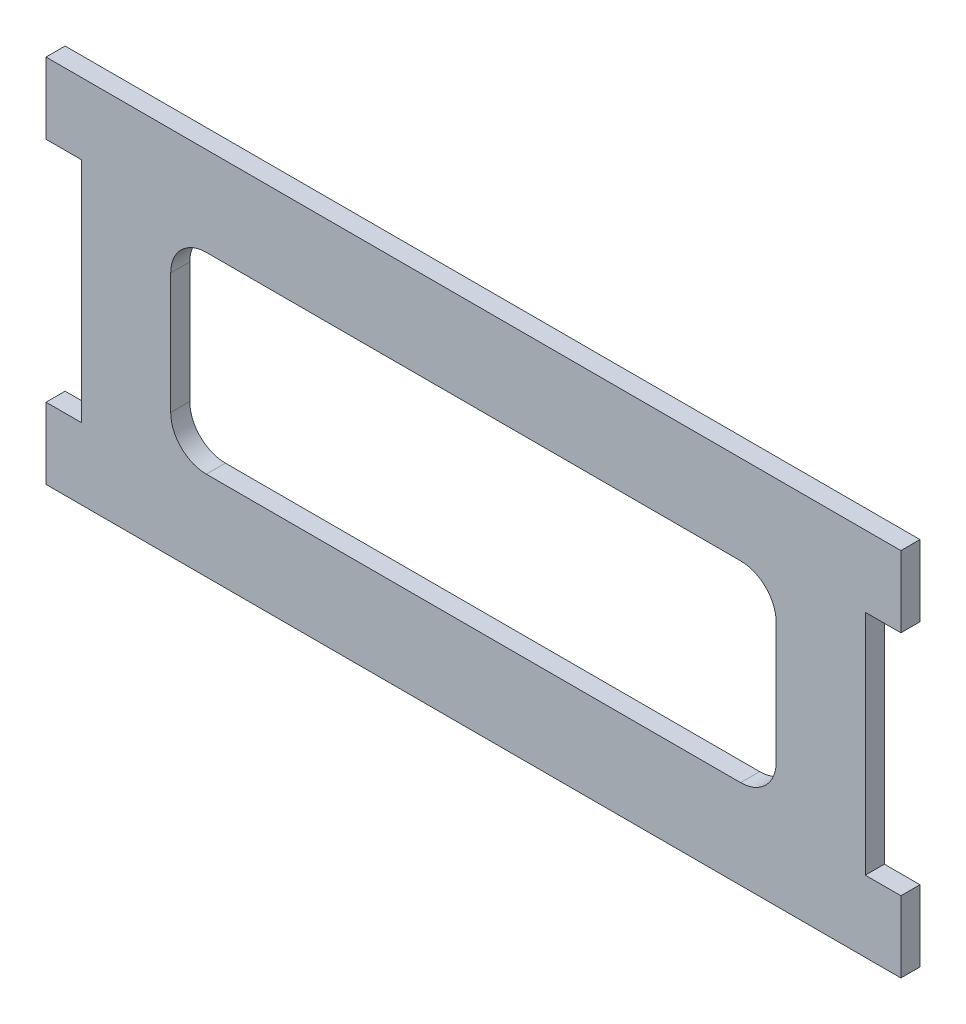
ISO-10303-21;
HEADER;
FILE_DESCRIPTION(('STEP AP214'),'2;1');
FILE_NAME('part.step','',(''),(''),'','','');
FILE_SCHEMA(('AUTOMOTIVE_DESIGN { 1 0 10303 214 1 1 1 1 }'));
ENDSEC;
DATA;
#1=APPLICATION_CONTEXT('core data for automotive mechanical design processes');
#2=APPLICATION_PROTOCOL_DEFINITION('international standard','automotive_design',2000,#1);
#3=PRODUCT_CONTEXT('',#1,'mechanical');
#4=PRODUCT('Part','Part','',(#3));
#5=PRODUCT_RELATED_PRODUCT_CATEGORY('part','',(#4));
#6=PRODUCT_DEFINITION_FORMATION('','',#4);
#7=PRODUCT_DEFINITION_CONTEXT('part definition',#1,'design');
#8=PRODUCT_DEFINITION('design','',#6,#7);
#9=PRODUCT_DEFINITION_SHAPE('','',#8);
#10=(LENGTH_UNIT() NAMED_UNIT(*) SI_UNIT(.MILLI.,.METRE.));
#11=(NAMED_UNIT(*) PLANE_ANGLE_UNIT() SI_UNIT($,.RADIAN.));
#12=(NAMED_UNIT(*) SI_UNIT($,.STERADIAN.) SOLID_ANGLE_UNIT());
#13=UNCERTAINTY_MEASURE_WITH_UNIT(LENGTH_MEASURE(1.E-05),#10,'distance_accuracy_value','');
#14=(GEOMETRIC_REPRESENTATION_CONTEXT(3) GLOBAL_UNCERTAINTY_ASSIGNED_CONTEXT((#13)) GLOBAL_UNIT_ASSIGNED_CONTEXT((#10,
#11,#12)) REPRESENTATION_CONTEXT('',''));
#15=CARTESIAN_POINT('',(0.,0.,0.));
#16=DIRECTION('',(0.,0.,1.));
#17=DIRECTION('',(1.,0.,0.));
#18=AXIS2_PLACEMENT_3D('',#15,#16,#17);
#19=CARTESIAN_POINT('',(0.,2983.80753980651,3.4036));
#20=DIRECTION('',(0.,-1.,0.));
#21=DIRECTION('',(0.,0.,-1.));
#22=AXIS2_PLACEMENT_3D('',#19,#20,#21);
#23=PLANE('',#22);
#24=DIRECTION('',(-1.,0.,0.));
#25=VECTOR('',#24,1.);
#26=CARTESIAN_POINT('',(0.,2983.80753980651,0.));
#27=LINE('',#26,#25);
#28=CARTESIAN_POINT('',(8694.9152974663,2983.80753980651,0.));
#29=VERTEX_POINT('',#28);
#30=CARTESIAN_POINT('',(8688.5652974663,2983.80753980651,0.));
#31=VERTEX_POINT('',#30);
#32=EDGE_CURVE('E235',#29,#31,#27,.T.);
#33=ORIENTED_EDGE('',*,*,#32,.F.);
#34=DIRECTION('',(0.,0.,-1.));
#35=VECTOR('',#34,1.);
#36=CARTESIAN_POINT('',(8694.9152974663,2983.80753980651,3.4036));
#37=LINE('',#36,#35);
#38=CARTESIAN_POINT('',(8694.9152974663,2983.80753980651,3.4036));
#39=VERTEX_POINT('',#38);
#40=EDGE_CURVE('E11',#39,#29,#37,.T.);
#41=ORIENTED_EDGE('',*,*,#40,.F.);
#42=DIRECTION('',(-1.,0.,0.));
#43=VECTOR('',#42,1.);
#44=CARTESIAN_POINT('',(0.,2983.80753980651,3.4036));
#45=LINE('',#44,#43);
#46=CARTESIAN_POINT('',(8688.5652974663,2983.80753980651,3.4036));
#47=VERTEX_POINT('',#46);
#48=EDGE_CURVE('E353',#39,#47,#45,.T.);
#49=ORIENTED_EDGE('',*,*,#48,.T.);
#50=DIRECTION('',(0.,0.,-1.));
#51=VECTOR('',#50,1.);
#52=CARTESIAN_POINT('',(8688.5652974663,2983.80753980651,3.4036));
#53=LINE('',#52,#51);
#54=EDGE_CURVE('E56',#47,#31,#53,.T.);
#55=ORIENTED_EDGE('',*,*,#54,.T.);
#56=EDGE_LOOP('',(#33,#41,#49,#55));
#57=FACE_BOUND('',#56,.T.);
#58=ADVANCED_FACE('F37',(#57),#23,.T.);
#59=CARTESIAN_POINT('',(8694.9152974663,0.,3.4036));
#60=DIRECTION('',(-1.,0.,0.));
#61=DIRECTION('',(0.,0.,1.));
#62=AXIS2_PLACEMENT_3D('',#59,#60,#61);
#63=PLANE('',#62);
#64=DIRECTION('',(0.,1.,0.));
#65=VECTOR('',#64,1.);
#66=CARTESIAN_POINT('',(8694.9152974663,0.,0.));
#67=LINE('',#66,#65);
#68=CARTESIAN_POINT('',(8694.9152974663,2996.50753980651,0.));
#69=VERTEX_POINT('',#68);
#70=EDGE_CURVE('E237',#29,#69,#67,.T.);
#71=ORIENTED_EDGE('',*,*,#70,.T.);
#72=DIRECTION('',(0.,0.,-1.));
#73=VECTOR('',#72,1.);
#74=CARTESIAN_POINT('',(8694.9152974663,2996.50753980651,3.4036));
#75=LINE('',#74,#73);
#76=CARTESIAN_POINT('',(8694.9152974663,2996.50753980651,3.4036));
#77=VERTEX_POINT('',#76);
#78=EDGE_CURVE('E47',#77,#69,#75,.T.);
#79=ORIENTED_EDGE('',*,*,#78,.F.);
#80=DIRECTION('',(0.,1.,0.));
#81=VECTOR('',#80,1.);
#82=CARTESIAN_POINT('',(8694.9152974663,0.,3.4036));
#83=LINE('',#82,#81);
#84=EDGE_CURVE('E355',#39,#77,#83,.T.);
#85=ORIENTED_EDGE('',*,*,#84,.F.);
#86=ORIENTED_EDGE('',*,*,#40,.T.);
#87=EDGE_LOOP('',(#71,#79,#85,#86));
#88=FACE_BOUND('',#87,.T.);
#89=ADVANCED_FACE('F393',(#88),#63,.F.);
#90=CARTESIAN_POINT('',(0.,2996.50753980651,3.4036));
#91=DIRECTION('',(0.,-1.,0.));
#92=DIRECTION('',(0.,0.,-1.));
#93=AXIS2_PLACEMENT_3D('',#90,#91,#92);
#94=PLANE('',#93);
#95=DIRECTION('',(-1.,0.,0.));
#96=VECTOR('',#95,1.);
#97=CARTESIAN_POINT('',(0.,2996.50753980651,0.));
#98=LINE('',#97,#96);
#99=CARTESIAN_POINT('',(8542.5152974663,2996.50753980651,0.));
#100=VERTEX_POINT('',#99);
#101=EDGE_CURVE('E240',#69,#100,#98,.T.);
#102=ORIENTED_EDGE('',*,*,#101,.T.);
#103=DIRECTION('',(0.,0.,-1.));
#104=VECTOR('',#103,1.);
#105=CARTESIAN_POINT('',(8542.5152974663,2996.50753980651,3.4036));
#106=LINE('',#105,#104);
#107=CARTESIAN_POINT('',(8542.5152974663,2996.50753980651,3.4036));
#108=VERTEX_POINT('',#107);
#109=EDGE_CURVE('E282',#108,#100,#106,.T.);
#110=ORIENTED_EDGE('',*,*,#109,.F.);
#111=DIRECTION('',(-1.,0.,0.));
#112=VECTOR('',#111,1.);
#113=CARTESIAN_POINT('',(0.,2996.50753980651,3.4036));
#114=LINE('',#113,#112);
#115=EDGE_CURVE('E358',#77,#108,#114,.T.);
#116=ORIENTED_EDGE('',*,*,#115,.F.);
#117=ORIENTED_EDGE('',*,*,#78,.T.);
#118=EDGE_LOOP('',(#102,#110,#116,#117));
#119=FACE_BOUND('',#118,.T.);
#120=ADVANCED_FACE('F398',(#119),#94,.F.);
#121=CARTESIAN_POINT('',(8542.5152974663,0.,3.4036));
#122=DIRECTION('',(1.,0.,0.));
#123=DIRECTION('',(0.,0.,-1.));
#124=AXIS2_PLACEMENT_3D('',#121,#122,#123);
#125=PLANE('',#124);
#126=DIRECTION('',(0.,-1.,0.));
#127=VECTOR('',#126,1.);
#128=CARTESIAN_POINT('',(8542.5152974663,0.,0.));
#129=LINE('',#128,#127);
#130=CARTESIAN_POINT('',(8542.5152974663,2983.80753980651,0.));
#131=VERTEX_POINT('',#130);
#132=EDGE_CURVE('E243',#100,#131,#129,.T.);
#133=ORIENTED_EDGE('',*,*,#132,.T.);
#134=DIRECTION('',(0.,0.,-1.));
#135=VECTOR('',#134,1.);
#136=CARTESIAN_POINT('',(8542.5152974663,2983.80753980651,3.4036));
#137=LINE('',#136,#135);
#138=CARTESIAN_POINT('',(8542.5152974663,2983.80753980651,3.4036));
#139=VERTEX_POINT('',#138);
#140=EDGE_CURVE('E280',#139,#131,#137,.T.);
#141=ORIENTED_EDGE('',*,*,#140,.F.);
#142=DIRECTION('',(0.,-1.,0.));
#143=VECTOR('',#142,1.);
#144=CARTESIAN_POINT('',(8542.5152974663,0.,3.4036));
#145=LINE('',#144,#143);
#146=EDGE_CURVE('E361',#108,#139,#145,.T.);
#147=ORIENTED_EDGE('',*,*,#146,.F.);
#148=ORIENTED_EDGE('',*,*,#109,.T.);
#149=EDGE_LOOP('',(#133,#141,#147,#148));
#150=FACE_BOUND('',#149,.T.);
#151=ADVANCED_FACE('F439',(#150),#125,.F.);
#152=CARTESIAN_POINT('',(0.,2983.80753980651,3.4036));
#153=DIRECTION('',(0.,-1.,0.));
#154=DIRECTION('',(0.,0.,-1.));
#155=AXIS2_PLACEMENT_3D('',#152,#153,#154);
#156=PLANE('',#155);
#157=DIRECTION('',(-1.,0.,0.));
#158=VECTOR('',#157,1.);
#159=CARTESIAN_POINT('',(0.,2983.80753980651,0.));
#160=LINE('',#159,#158);
#161=CARTESIAN_POINT('',(8548.8652974663,2983.80753980651,0.));
#162=VERTEX_POINT('',#161);
#163=EDGE_CURVE('E246',#162,#131,#160,.T.);
#164=ORIENTED_EDGE('',*,*,#163,.F.);
#165=DIRECTION('',(0.,0.,-1.));
#166=VECTOR('',#165,1.);
#167=CARTESIAN_POINT('',(8548.8652974663,2983.80753980651,3.4036));
#168=LINE('',#167,#166);
#169=CARTESIAN_POINT('',(8548.8652974663,2983.80753980651,3.4036));
#170=VERTEX_POINT('',#169);
#171=EDGE_CURVE('E278',#170,#162,#168,.T.);
#172=ORIENTED_EDGE('',*,*,#171,.F.);
#173=DIRECTION('',(-1.,0.,0.));
#174=VECTOR('',#173,1.);
#175=CARTESIAN_POINT('',(0.,2983.80753980651,3.4036));
#176=LINE('',#175,#174);
#177=EDGE_CURVE('E363',#170,#139,#176,.T.);
#178=ORIENTED_EDGE('',*,*,#177,.T.);
#179=ORIENTED_EDGE('',*,*,#140,.T.);
#180=EDGE_LOOP('',(#164,#172,#178,#179));
#181=FACE_BOUND('',#180,.T.);
#182=ADVANCED_FACE('F435',(#181),#156,.T.);
#183=CARTESIAN_POINT('',(8548.8652974663,0.,3.4036));
#184=DIRECTION('',(-1.,0.,0.));
#185=DIRECTION('',(0.,0.,1.));
#186=AXIS2_PLACEMENT_3D('',#183,#184,#185);
#187=PLANE('',#186);
#188=DIRECTION('',(0.,1.,0.));
#189=VECTOR('',#188,1.);
#190=CARTESIAN_POINT('',(8548.8652974663,0.,0.));
#191=LINE('',#190,#189);
#192=CARTESIAN_POINT('',(8548.8652974663,2943.21833980651,0.));
#193=VERTEX_POINT('',#192);
#194=EDGE_CURVE('E249',#193,#162,#191,.T.);
#195=ORIENTED_EDGE('',*,*,#194,.F.);
#196=DIRECTION('',(0.,0.,-1.));
#197=VECTOR('',#196,1.);
#198=CARTESIAN_POINT('',(8548.8652974663,2943.21833980651,3.4036));
#199=LINE('',#198,#197);
#200=CARTESIAN_POINT('',(8548.8652974663,2943.21833980651,3.4036));
#201=VERTEX_POINT('',#200);
#202=EDGE_CURVE('E276',#201,#193,#199,.T.);
#203=ORIENTED_EDGE('',*,*,#202,.F.);
#204=DIRECTION('',(0.,1.,0.));
#205=VECTOR('',#204,1.);
#206=CARTESIAN_POINT('',(8548.8652974663,0.,3.4036));
#207=LINE('',#206,#205);
#208=EDGE_CURVE('E366',#201,#170,#207,.T.);
#209=ORIENTED_EDGE('',*,*,#208,.T.);
#210=ORIENTED_EDGE('',*,*,#171,.T.);
#211=EDGE_LOOP('',(#195,#203,#209,#210));
#212=FACE_BOUND('',#211,.T.);
#213=ADVANCED_FACE('F431',(#212),#187,.T.);
#214=CARTESIAN_POINT('',(0.,2943.21833980651,3.4036));
#215=DIRECTION('',(0.,-1.,0.));
#216=DIRECTION('',(0.,0.,-1.));
#217=AXIS2_PLACEMENT_3D('',#214,#215,#216);
#218=PLANE('',#217);
#219=DIRECTION('',(-1.,0.,0.));
#220=VECTOR('',#219,1.);
#221=CARTESIAN_POINT('',(0.,2943.21833980651,0.));
#222=LINE('',#221,#220);
#223=CARTESIAN_POINT('',(8542.5152974663,2943.21833980651,0.));
#224=VERTEX_POINT('',#223);
#225=EDGE_CURVE('E252',#193,#224,#222,.T.);
#226=ORIENTED_EDGE('',*,*,#225,.T.);
#227=DIRECTION('',(0.,0.,-1.));
#228=VECTOR('',#227,1.);
#229=CARTESIAN_POINT('',(8542.5152974663,2943.21833980651,3.4036));
#230=LINE('',#229,#228);
#231=CARTESIAN_POINT('',(8542.5152974663,2943.21833980651,3.4036));
#232=VERTEX_POINT('',#231);
#233=EDGE_CURVE('E273',#232,#224,#230,.T.);
#234=ORIENTED_EDGE('',*,*,#233,.F.);
#235=DIRECTION('',(-1.,0.,0.));
#236=VECTOR('',#235,1.);
#237=CARTESIAN_POINT('',(0.,2943.21833980651,3.4036));
#238=LINE('',#237,#236);
#239=EDGE_CURVE('E369',#201,#232,#238,.T.);
#240=ORIENTED_EDGE('',*,*,#239,.F.);
#241=ORIENTED_EDGE('',*,*,#202,.T.);
#242=EDGE_LOOP('',(#226,#234,#240,#241));
#243=FACE_BOUND('',#242,.T.);
#244=ADVANCED_FACE('F428',(#243),#218,.F.);
#245=CARTESIAN_POINT('',(8542.5152974663,0.,3.4036));
#246=DIRECTION('',(1.,0.,0.));
#247=DIRECTION('',(0.,0.,-1.));
#248=AXIS2_PLACEMENT_3D('',#245,#246,#247);
#249=PLANE('',#248);
#250=DIRECTION('',(0.,-1.,0.));
#251=VECTOR('',#250,1.);
#252=CARTESIAN_POINT('',(8542.5152974663,0.,0.));
#253=LINE('',#252,#251);
#254=CARTESIAN_POINT('',(8542.5152974663,2930.51833980651,0.));
#255=VERTEX_POINT('',#254);
#256=EDGE_CURVE('E255',#224,#255,#253,.T.);
#257=ORIENTED_EDGE('',*,*,#256,.T.);
#258=DIRECTION('',(0.,0.,-1.));
#259=VECTOR('',#258,1.);
#260=CARTESIAN_POINT('',(8542.5152974663,2930.51833980651,3.4036));
#261=LINE('',#260,#259);
#262=CARTESIAN_POINT('',(8542.5152974663,2930.51833980651,3.4036));
#263=VERTEX_POINT('',#262);
#264=EDGE_CURVE('E271',#263,#255,#261,.T.);
#265=ORIENTED_EDGE('',*,*,#264,.F.);
#266=DIRECTION('',(0.,-1.,0.));
#267=VECTOR('',#266,1.);
#268=CARTESIAN_POINT('',(8542.5152974663,0.,3.4036));
#269=LINE('',#268,#267);
#270=EDGE_CURVE('E205',#232,#263,#269,.T.);
#271=ORIENTED_EDGE('',*,*,#270,.F.);
#272=ORIENTED_EDGE('',*,*,#233,.T.);
#273=EDGE_LOOP('',(#257,#265,#271,#272));
#274=FACE_BOUND('',#273,.T.);
#275=ADVANCED_FACE('F376',(#274),#249,.F.);
#276=CARTESIAN_POINT('',(0.,2930.51833980651,3.4036));
#277=DIRECTION('',(0.,-1.,0.));
#278=DIRECTION('',(0.,0.,-1.));
#279=AXIS2_PLACEMENT_3D('',#276,#277,#278);
#280=PLANE('',#279);
#281=DIRECTION('',(-1.,0.,0.));
#282=VECTOR('',#281,1.);
#283=CARTESIAN_POINT('',(0.,2930.51833980651,0.));
#284=LINE('',#283,#282);
#285=CARTESIAN_POINT('',(8694.9152974663,2930.51833980651,0.));
#286=VERTEX_POINT('',#285);
#287=EDGE_CURVE('E258',#286,#255,#284,.T.);
#288=ORIENTED_EDGE('',*,*,#287,.F.);
#289=DIRECTION('',(0.,0.,-1.));
#290=VECTOR('',#289,1.);
#291=CARTESIAN_POINT('',(8694.9152974663,2930.51833980651,3.4036));
#292=LINE('',#291,#290);
#293=CARTESIAN_POINT('',(8694.9152974663,2930.51833980651,3.4036));
#294=VERTEX_POINT('',#293);
#295=EDGE_CURVE('E191',#294,#286,#292,.T.);
#296=ORIENTED_EDGE('',*,*,#295,.F.);
#297=DIRECTION('',(-1.,0.,0.));
#298=VECTOR('',#297,1.);
#299=CARTESIAN_POINT('',(0.,2930.51833980651,3.4036));
#300=LINE('',#299,#298);
#301=EDGE_CURVE('E203',#294,#263,#300,.T.);
#302=ORIENTED_EDGE('',*,*,#301,.T.);
#303=ORIENTED_EDGE('',*,*,#264,.T.);
#304=EDGE_LOOP('',(#288,#296,#302,#303));
#305=FACE_BOUND('',#304,.T.);
#306=ADVANCED_FACE('F379',(#305),#280,.T.);
#307=CARTESIAN_POINT('',(8694.9152974663,0.,3.4036));
#308=DIRECTION('',(1.,0.,0.));
#309=DIRECTION('',(0.,0.,-1.));
#310=AXIS2_PLACEMENT_3D('',#307,#308,#309);
#311=PLANE('',#310);
#312=DIRECTION('',(0.,-1.,0.));
#313=VECTOR('',#312,1.);
#314=CARTESIAN_POINT('',(8694.9152974663,0.,0.));
#315=LINE('',#314,#313);
#316=CARTESIAN_POINT('',(8694.9152974663,2943.21833980651,0.));
#317=VERTEX_POINT('',#316);
#318=EDGE_CURVE('E188',#317,#286,#315,.T.);
#319=ORIENTED_EDGE('',*,*,#318,.F.);
#320=DIRECTION('',(0.,0.,-1.));
#321=VECTOR('',#320,1.);
#322=CARTESIAN_POINT('',(8694.9152974663,2943.21833980651,3.4036));
#323=LINE('',#322,#321);
#324=CARTESIAN_POINT('',(8694.9152974663,2943.21833980651,3.4036));
#325=VERTEX_POINT('',#324);
#326=EDGE_CURVE('E182',#325,#317,#323,.T.);
#327=ORIENTED_EDGE('',*,*,#326,.F.);
#328=DIRECTION('',(0.,-1.,0.));
#329=VECTOR('',#328,1.);
#330=CARTESIAN_POINT('',(8694.9152974663,0.,3.4036));
#331=LINE('',#330,#329);
#332=EDGE_CURVE('E186',#325,#294,#331,.T.);
#333=ORIENTED_EDGE('',*,*,#332,.T.);
#334=ORIENTED_EDGE('',*,*,#295,.T.);
#335=EDGE_LOOP('',(#319,#327,#333,#334));
#336=FACE_BOUND('',#335,.T.);
#337=ADVANCED_FACE('F184',(#336),#311,.T.);
#338=CARTESIAN_POINT('',(0.,2943.21833980651,3.4036));
#339=DIRECTION('',(0.,-1.,0.));
#340=DIRECTION('',(0.,0.,-1.));
#341=AXIS2_PLACEMENT_3D('',#338,#339,#340);
#342=PLANE('',#341);
#343=DIRECTION('',(-1.,0.,0.));
#344=VECTOR('',#343,1.);
#345=CARTESIAN_POINT('',(0.,2943.21833980651,0.));
#346=LINE('',#345,#344);
#347=CARTESIAN_POINT('',(8688.5652974663,2943.21833980651,0.));
#348=VERTEX_POINT('',#347);
#349=EDGE_CURVE('E262',#317,#348,#346,.T.);
#350=ORIENTED_EDGE('',*,*,#349,.T.);
#351=DIRECTION('',(0.,0.,-1.));
#352=VECTOR('',#351,1.);
#353=CARTESIAN_POINT('',(8688.5652974663,2943.21833980651,3.4036));
#354=LINE('',#353,#352);
#355=CARTESIAN_POINT('',(8688.5652974663,2943.21833980651,3.4036));
#356=VERTEX_POINT('',#355);
#357=EDGE_CURVE('E118',#356,#348,#354,.T.);
#358=ORIENTED_EDGE('',*,*,#357,.F.);
#359=DIRECTION('',(-1.,0.,0.));
#360=VECTOR('',#359,1.);
#361=CARTESIAN_POINT('',(0.,2943.21833980651,3.4036));
#362=LINE('',#361,#360);
#363=EDGE_CURVE('E193',#325,#356,#362,.T.);
#364=ORIENTED_EDGE('',*,*,#363,.F.);
#365=ORIENTED_EDGE('',*,*,#326,.T.);
#366=EDGE_LOOP('',(#350,#358,#364,#365));
#367=FACE_BOUND('',#366,.T.);
#368=ADVANCED_FACE('F194',(#367),#342,.F.);
#369=CARTESIAN_POINT('',(8666.3402974663,2952.74333980651,3.4036));
#370=DIRECTION('',(0.,0.,-1.));
#371=DIRECTION('',(-1.,0.,0.));
#372=AXIS2_PLACEMENT_3D('',#369,#370,#371);
#373=CYLINDRICAL_SURFACE('',#372,6.34999999999986);
#374=CARTESIAN_POINT('',(8666.3402974663,2952.74333980651,0.));
#375=DIRECTION('',(0.,0.,1.));
#376=DIRECTION('',(1.,0.,0.));
#377=AXIS2_PLACEMENT_3D('',#374,#375,#376);
#378=CIRCLE('',#377,6.34999999999986);
#379=CARTESIAN_POINT('',(8666.3402974663,2946.39333980651,0.));
#380=VERTEX_POINT('',#379);
#381=CARTESIAN_POINT('',(8672.6902974663,2952.74333980651,0.));
#382=VERTEX_POINT('',#381);
#383=EDGE_CURVE('E211',#380,#382,#378,.T.);
#384=ORIENTED_EDGE('',*,*,#383,.F.);
#385=DIRECTION('',(0.,0.,-1.));
#386=VECTOR('',#385,1.);
#387=CARTESIAN_POINT('',(8666.3402974663,2946.39333980651,3.4036));
#388=LINE('',#387,#386);
#389=CARTESIAN_POINT('',(8666.3402974663,2946.39333980651,3.4036));
#390=VERTEX_POINT('',#389);
#391=EDGE_CURVE('E41',#390,#380,#388,.T.);
#392=ORIENTED_EDGE('',*,*,#391,.F.);
#393=CARTESIAN_POINT('',(8666.3402974663,2952.74333980651,3.4036));
#394=DIRECTION('',(0.,0.,1.));
#395=DIRECTION('',(1.,0.,0.));
#396=AXIS2_PLACEMENT_3D('',#393,#394,#395);
#397=CIRCLE('',#396,6.34999999999986);
#398=CARTESIAN_POINT('',(8672.6902974663,2952.74333980651,3.4036));
#399=VERTEX_POINT('',#398);
#400=EDGE_CURVE('E267',#390,#399,#397,.T.);
#401=ORIENTED_EDGE('',*,*,#400,.T.);
#402=DIRECTION('',(0.,0.,-1.));
#403=VECTOR('',#402,1.);
#404=CARTESIAN_POINT('',(8672.6902974663,2952.74333980651,3.4036));
#405=LINE('',#404,#403);
#406=EDGE_CURVE('E210',#399,#382,#405,.T.);
#407=ORIENTED_EDGE('',*,*,#406,.T.);
#408=EDGE_LOOP('',(#384,#392,#401,#407));
#409=FACE_BOUND('',#408,.T.);
#410=ADVANCED_FACE('F39',(#409),#373,.F.);
#411=CARTESIAN_POINT('',(-1.37371285058493E-11,2946.39333980647,3.4036));
#412=DIRECTION('',(0.,-1.,0.));
#413=DIRECTION('',(1.,0.,0.));
#414=AXIS2_PLACEMENT_3D('',#411,#412,#413);
#415=PLANE('',#414);
#416=DIRECTION('',(-1.,0.,0.));
#417=VECTOR('',#416,1.);
#418=CARTESIAN_POINT('',(-1.37371285058493E-11,2946.39333980647,0.));
#419=LINE('',#418,#417);
#420=CARTESIAN_POINT('',(8571.0902974663,2946.39333980651,0.));
#421=VERTEX_POINT('',#420);
#422=EDGE_CURVE('E214',#380,#421,#419,.T.);
#423=ORIENTED_EDGE('',*,*,#422,.T.);
#424=DIRECTION('',(0.,0.,-1.));
#425=VECTOR('',#424,1.);
#426=CARTESIAN_POINT('',(8571.0902974663,2946.39333980651,3.4036));
#427=LINE('',#426,#425);
#428=CARTESIAN_POINT('',(8571.0902974663,2946.39333980651,3.4036));
#429=VERTEX_POINT('',#428);
#430=EDGE_CURVE('E297',#429,#421,#427,.T.);
#431=ORIENTED_EDGE('',*,*,#430,.F.);
#432=DIRECTION('',(-1.,0.,0.));
#433=VECTOR('',#432,1.);
#434=CARTESIAN_POINT('',(-1.37371285058493E-11,2946.39333980647,3.4036));
#435=LINE('',#434,#433);
#436=EDGE_CURVE('E305',#390,#429,#435,.T.);
#437=ORIENTED_EDGE('',*,*,#436,.F.);
#438=ORIENTED_EDGE('',*,*,#391,.T.);
#439=EDGE_LOOP('',(#423,#431,#437,#438));
#440=FACE_BOUND('',#439,.T.);
#441=ADVANCED_FACE('F304',(#440),#415,.F.);
#442=CARTESIAN_POINT('',(8571.0902974663,2952.74333980651,3.4036));
#443=DIRECTION('',(0.,0.,-1.));
#444=DIRECTION('',(-1.,0.,0.));
#445=AXIS2_PLACEMENT_3D('',#442,#443,#444);
#446=CYLINDRICAL_SURFACE('',#445,6.34999999999963);
#447=CARTESIAN_POINT('',(8571.0902974663,2952.74333980651,0.));
#448=DIRECTION('',(0.,0.,1.));
#449=DIRECTION('',(1.,0.,0.));
#450=AXIS2_PLACEMENT_3D('',#447,#448,#449);
#451=CIRCLE('',#450,6.34999999999963);
#452=CARTESIAN_POINT('',(8564.7402974663,2952.74333980651,0.));
#453=VERTEX_POINT('',#452);
#454=EDGE_CURVE('E217',#453,#421,#451,.T.);
#455=ORIENTED_EDGE('',*,*,#454,.F.);
#456=DIRECTION('',(0.,0.,-1.));
#457=VECTOR('',#456,1.);
#458=CARTESIAN_POINT('',(8564.7402974663,2952.74333980651,3.4036));
#459=LINE('',#458,#457);
#460=CARTESIAN_POINT('',(8564.7402974663,2952.74333980651,3.4036));
#461=VERTEX_POINT('',#460);
#462=EDGE_CURVE('E296',#461,#453,#459,.T.);
#463=ORIENTED_EDGE('',*,*,#462,.F.);
#464=CARTESIAN_POINT('',(8571.0902974663,2952.74333980651,3.4036));
#465=DIRECTION('',(0.,0.,1.));
#466=DIRECTION('',(1.,0.,0.));
#467=AXIS2_PLACEMENT_3D('',#464,#465,#466);
#468=CIRCLE('',#467,6.34999999999963);
#469=EDGE_CURVE('E340',#461,#429,#468,.T.);
#470=ORIENTED_EDGE('',*,*,#469,.T.);
#471=ORIENTED_EDGE('',*,*,#430,.T.);
#472=EDGE_LOOP('',(#455,#463,#470,#471));
#473=FACE_BOUND('',#472,.T.);
#474=ADVANCED_FACE('F339',(#473),#446,.F.);
#475=CARTESIAN_POINT('',(8564.74029746605,-7.06341693521184E-10,3.4036));
#476=DIRECTION('',(-1.,0.,0.));
#477=DIRECTION('',(0.,-1.,0.));
#478=AXIS2_PLACEMENT_3D('',#475,#476,#477);
#479=PLANE('',#478);
#480=DIRECTION('',(0.,1.,0.));
#481=VECTOR('',#480,1.);
#482=CARTESIAN_POINT('',(8564.74029746605,-7.06341693521184E-10,0.));
#483=LINE('',#482,#481);
#484=CARTESIAN_POINT('',(8564.7402974663,2974.28253980651,0.));
#485=VERTEX_POINT('',#484);
#486=EDGE_CURVE('E220',#453,#485,#483,.T.);
#487=ORIENTED_EDGE('',*,*,#486,.T.);
#488=DIRECTION('',(0.,0.,-1.));
#489=VECTOR('',#488,1.);
#490=CARTESIAN_POINT('',(8564.7402974663,2974.28253980651,3.4036));
#491=LINE('',#490,#489);
#492=CARTESIAN_POINT('',(8564.7402974663,2974.28253980651,3.4036));
#493=VERTEX_POINT('',#492);
#494=EDGE_CURVE('E294',#493,#485,#491,.T.);
#495=ORIENTED_EDGE('',*,*,#494,.F.);
#496=DIRECTION('',(0.,1.,0.));
#497=VECTOR('',#496,1.);
#498=CARTESIAN_POINT('',(8564.74029746605,-7.06341693521184E-10,3.4036));
#499=LINE('',#498,#497);
#500=EDGE_CURVE('E337',#461,#493,#499,.T.);
#501=ORIENTED_EDGE('',*,*,#500,.F.);
#502=ORIENTED_EDGE('',*,*,#462,.T.);
#503=EDGE_LOOP('',(#487,#495,#501,#502));
#504=FACE_BOUND('',#503,.T.);
#505=ADVANCED_FACE('F336',(#504),#479,.F.);
#506=CARTESIAN_POINT('',(8571.0902974663,2974.28253980651,3.4036));
#507=DIRECTION('',(0.,0.,-1.));
#508=DIRECTION('',(-1.,0.,0.));
#509=AXIS2_PLACEMENT_3D('',#506,#507,#508);
#510=CYLINDRICAL_SURFACE('',#509,6.35000000000052);
#511=CARTESIAN_POINT('',(8571.0902974663,2974.28253980651,0.));
#512=DIRECTION('',(0.,0.,1.));
#513=DIRECTION('',(1.,0.,0.));
#514=AXIS2_PLACEMENT_3D('',#511,#512,#513);
#515=CIRCLE('',#514,6.35000000000052);
#516=CARTESIAN_POINT('',(8571.0902974663,2980.63253980651,0.));
#517=VERTEX_POINT('',#516);
#518=EDGE_CURVE('E223',#517,#485,#515,.T.);
#519=ORIENTED_EDGE('',*,*,#518,.F.);
#520=DIRECTION('',(0.,0.,-1.));
#521=VECTOR('',#520,1.);
#522=CARTESIAN_POINT('',(8571.0902974663,2980.63253980651,3.4036));
#523=LINE('',#522,#521);
#524=CARTESIAN_POINT('',(8571.0902974663,2980.63253980651,3.4036));
#525=VERTEX_POINT('',#524);
#526=EDGE_CURVE('E292',#525,#517,#523,.T.);
#527=ORIENTED_EDGE('',*,*,#526,.F.);
#528=CARTESIAN_POINT('',(8571.0902974663,2974.28253980651,3.4036));
#529=DIRECTION('',(0.,0.,1.));
#530=DIRECTION('',(1.,0.,0.));
#531=AXIS2_PLACEMENT_3D('',#528,#529,#530);
#532=CIRCLE('',#531,6.35000000000052);
#533=EDGE_CURVE('E333',#525,#493,#532,.T.);
#534=ORIENTED_EDGE('',*,*,#533,.T.);
#535=ORIENTED_EDGE('',*,*,#494,.T.);
#536=EDGE_LOOP('',(#519,#527,#534,#535));
#537=FACE_BOUND('',#536,.T.);
#538=ADVANCED_FACE('F329',(#537),#510,.F.);
#539=CARTESIAN_POINT('',(0.,2980.63253980651,3.4036));
#540=DIRECTION('',(0.,-1.,0.));
#541=DIRECTION('',(0.,0.,-1.));
#542=AXIS2_PLACEMENT_3D('',#539,#540,#541);
#543=PLANE('',#542);
#544=DIRECTION('',(-1.,0.,0.));
#545=VECTOR('',#544,1.);
#546=CARTESIAN_POINT('',(0.,2980.63253980651,0.));
#547=LINE('',#546,#545);
#548=CARTESIAN_POINT('',(8666.3402974663,2980.63253980651,0.));
#549=VERTEX_POINT('',#548);
#550=EDGE_CURVE('E226',#549,#517,#547,.T.);
#551=ORIENTED_EDGE('',*,*,#550,.F.);
#552=DIRECTION('',(0.,0.,-1.));
#553=VECTOR('',#552,1.);
#554=CARTESIAN_POINT('',(8666.3402974663,2980.63253980651,3.4036));
#555=LINE('',#554,#553);
#556=CARTESIAN_POINT('',(8666.3402974663,2980.63253980651,3.4036));
#557=VERTEX_POINT('',#556);
#558=EDGE_CURVE('E290',#557,#549,#555,.T.);
#559=ORIENTED_EDGE('',*,*,#558,.F.);
#560=DIRECTION('',(-1.,0.,0.));
#561=VECTOR('',#560,1.);
#562=CARTESIAN_POINT('',(0.,2980.63253980651,3.4036));
#563=LINE('',#562,#561);
#564=EDGE_CURVE('E348',#557,#525,#563,.T.);
#565=ORIENTED_EDGE('',*,*,#564,.T.);
#566=ORIENTED_EDGE('',*,*,#526,.T.);
#567=EDGE_LOOP('',(#551,#559,#565,#566));
#568=FACE_BOUND('',#567,.T.);
#569=ADVANCED_FACE('F326',(#568),#543,.T.);
#570=CARTESIAN_POINT('',(8666.3402974663,2974.28253980651,3.4036));
#571=DIRECTION('',(0.,0.,-1.));
#572=DIRECTION('',(-1.,0.,0.));
#573=AXIS2_PLACEMENT_3D('',#570,#571,#572);
#574=CYLINDRICAL_SURFACE('',#573,6.34999999999963);
#575=CARTESIAN_POINT('',(8666.3402974663,2974.28253980651,0.));
#576=DIRECTION('',(0.,0.,1.));
#577=DIRECTION('',(1.,0.,0.));
#578=AXIS2_PLACEMENT_3D('',#575,#576,#577);
#579=CIRCLE('',#578,6.34999999999963);
#580=CARTESIAN_POINT('',(8672.6902974663,2974.28253980651,0.));
#581=VERTEX_POINT('',#580);
#582=EDGE_CURVE('E229',#581,#549,#579,.T.);
#583=ORIENTED_EDGE('',*,*,#582,.F.);
#584=DIRECTION('',(0.,0.,-1.));
#585=VECTOR('',#584,1.);
#586=CARTESIAN_POINT('',(8672.6902974663,2974.28253980651,3.4036));
#587=LINE('',#586,#585);
#588=CARTESIAN_POINT('',(8672.6902974663,2974.28253980651,3.4036));
#589=VERTEX_POINT('',#588);
#590=EDGE_CURVE('E288',#589,#581,#587,.T.);
#591=ORIENTED_EDGE('',*,*,#590,.F.);
#592=CARTESIAN_POINT('',(8666.3402974663,2974.28253980651,3.4036));
#593=DIRECTION('',(0.,0.,1.));
#594=DIRECTION('',(1.,0.,0.));
#595=AXIS2_PLACEMENT_3D('',#592,#593,#594);
#596=CIRCLE('',#595,6.34999999999963);
#597=EDGE_CURVE('E322',#589,#557,#596,.T.);
#598=ORIENTED_EDGE('',*,*,#597,.T.);
#599=ORIENTED_EDGE('',*,*,#558,.T.);
#600=EDGE_LOOP('',(#583,#591,#598,#599));
#601=FACE_BOUND('',#600,.T.);
#602=ADVANCED_FACE('F318',(#601),#574,.F.);
#603=CARTESIAN_POINT('',(8672.6902974663,0.,3.4036));
#604=DIRECTION('',(1.,0.,0.));
#605=DIRECTION('',(0.,0.,-1.));
#606=AXIS2_PLACEMENT_3D('',#603,#604,#605);
#607=PLANE('',#606);
#608=DIRECTION('',(0.,-1.,0.));
#609=VECTOR('',#608,1.);
#610=CARTESIAN_POINT('',(8672.6902974663,0.,0.));
#611=LINE('',#610,#609);
#612=EDGE_CURVE('E232',#581,#382,#611,.T.);
#613=ORIENTED_EDGE('',*,*,#612,.T.);
#614=ORIENTED_EDGE('',*,*,#406,.F.);
#615=DIRECTION('',(0.,-1.,0.));
#616=VECTOR('',#615,1.);
#617=CARTESIAN_POINT('',(8672.6902974663,0.,3.4036));
#618=LINE('',#617,#616);
#619=EDGE_CURVE('E351',#589,#399,#618,.T.);
#620=ORIENTED_EDGE('',*,*,#619,.F.);
#621=ORIENTED_EDGE('',*,*,#590,.T.);
#622=EDGE_LOOP('',(#613,#614,#620,#621));
#623=FACE_BOUND('',#622,.T.);
#624=ADVANCED_FACE('F315',(#623),#607,.F.);
#625=CARTESIAN_POINT('',(8688.5652974663,0.,3.4036));
#626=DIRECTION('',(1.,0.,0.));
#627=DIRECTION('',(0.,0.,-1.));
#628=AXIS2_PLACEMENT_3D('',#625,#626,#627);
#629=PLANE('',#628);
#630=DIRECTION('',(0.,-1.,0.));
#631=VECTOR('',#630,1.);
#632=CARTESIAN_POINT('',(8688.5652974663,0.,0.));
#633=LINE('',#632,#631);
#634=EDGE_CURVE('E264',#31,#348,#633,.T.);
#635=ORIENTED_EDGE('',*,*,#634,.F.);
#636=ORIENTED_EDGE('',*,*,#54,.F.);
#637=DIRECTION('',(0.,-1.,0.));
#638=VECTOR('',#637,1.);
#639=CARTESIAN_POINT('',(8688.5652974663,0.,3.4036));
#640=LINE('',#639,#638);
#641=EDGE_CURVE('E197',#47,#356,#640,.T.);
#642=ORIENTED_EDGE('',*,*,#641,.T.);
#643=ORIENTED_EDGE('',*,*,#357,.T.);
#644=EDGE_LOOP('',(#635,#636,#642,#643));
#645=FACE_BOUND('',#644,.T.);
#646=ADVANCED_FACE('F381',(#645),#629,.T.);
#647=CARTESIAN_POINT('',(0.,0.,3.4036));
#648=DIRECTION('',(0.,0.,1.));
#649=DIRECTION('',(1.,0.,0.));
#650=AXIS2_PLACEMENT_3D('',#647,#648,#649);
#651=PLANE('',#650);
#652=ORIENTED_EDGE('',*,*,#400,.F.);
#653=ORIENTED_EDGE('',*,*,#436,.T.);
#654=ORIENTED_EDGE('',*,*,#469,.F.);
#655=ORIENTED_EDGE('',*,*,#500,.T.);
#656=ORIENTED_EDGE('',*,*,#533,.F.);
#657=ORIENTED_EDGE('',*,*,#564,.F.);
#658=ORIENTED_EDGE('',*,*,#597,.F.);
#659=ORIENTED_EDGE('',*,*,#619,.T.);
#660=EDGE_LOOP('',(#652,#653,#654,#655,#656,#657,#658,#659));
#661=FACE_BOUND('',#660,.T.);
#662=ORIENTED_EDGE('',*,*,#48,.F.);
#663=ORIENTED_EDGE('',*,*,#84,.T.);
#664=ORIENTED_EDGE('',*,*,#115,.T.);
#665=ORIENTED_EDGE('',*,*,#146,.T.);
#666=ORIENTED_EDGE('',*,*,#177,.F.);
#667=ORIENTED_EDGE('',*,*,#208,.F.);
#668=ORIENTED_EDGE('',*,*,#239,.T.);
#669=ORIENTED_EDGE('',*,*,#270,.T.);
#670=ORIENTED_EDGE('',*,*,#301,.F.);
#671=ORIENTED_EDGE('',*,*,#332,.F.);
#672=ORIENTED_EDGE('',*,*,#363,.T.);
#673=ORIENTED_EDGE('',*,*,#641,.F.);
#674=EDGE_LOOP('',(#662,#663,#664,#665,#666,#667,#668,#669,#670,#671,#672,#673));
#675=FACE_BOUND('',#674,.T.);
#676=ADVANCED_FACE('F201',(#661,#675),#651,.T.);
#677=CARTESIAN_POINT('',(0.,0.,0.));
#678=DIRECTION('',(0.,0.,1.));
#679=DIRECTION('',(1.,0.,0.));
#680=AXIS2_PLACEMENT_3D('',#677,#678,#679);
#681=PLANE('',#680);
#682=ORIENTED_EDGE('',*,*,#383,.T.);
#683=ORIENTED_EDGE('',*,*,#612,.F.);
#684=ORIENTED_EDGE('',*,*,#582,.T.);
#685=ORIENTED_EDGE('',*,*,#550,.T.);
#686=ORIENTED_EDGE('',*,*,#518,.T.);
#687=ORIENTED_EDGE('',*,*,#486,.F.);
#688=ORIENTED_EDGE('',*,*,#454,.T.);
#689=ORIENTED_EDGE('',*,*,#422,.F.);
#690=EDGE_LOOP('',(#682,#683,#684,#685,#686,#687,#688,#689));
#691=FACE_BOUND('',#690,.T.);
#692=ORIENTED_EDGE('',*,*,#32,.T.);
#693=ORIENTED_EDGE('',*,*,#634,.T.);
#694=ORIENTED_EDGE('',*,*,#349,.F.);
#695=ORIENTED_EDGE('',*,*,#318,.T.);
#696=ORIENTED_EDGE('',*,*,#287,.T.);
#697=ORIENTED_EDGE('',*,*,#256,.F.);
#698=ORIENTED_EDGE('',*,*,#225,.F.);
#699=ORIENTED_EDGE('',*,*,#194,.T.);
#700=ORIENTED_EDGE('',*,*,#163,.T.);
#701=ORIENTED_EDGE('',*,*,#132,.F.);
#702=ORIENTED_EDGE('',*,*,#101,.F.);
#703=ORIENTED_EDGE('',*,*,#70,.F.);
#704=EDGE_LOOP('',(#692,#693,#694,#695,#696,#697,#698,#699,#700,#701,#702,#703));
#705=FACE_BOUND('',#704,.T.);
#706=ADVANCED_FACE('F308',(#691,#705),#681,.F.);
#707=CLOSED_SHELL('',(#58,#89,#120,#151,#182,#213,#244,#275,#306,#337,#368,#410,#441,#474,#505,
#538,#569,#602,#624,#646,#676,#706));
#708=MANIFOLD_SOLID_BREP('B2',#707);
#709=ADVANCED_BREP_SHAPE_REPRESENTATION('',(#18,#708),#14);
#710=SHAPE_DEFINITION_REPRESENTATION(#9,#709);
ENDSEC;
END-ISO-10303-21;
